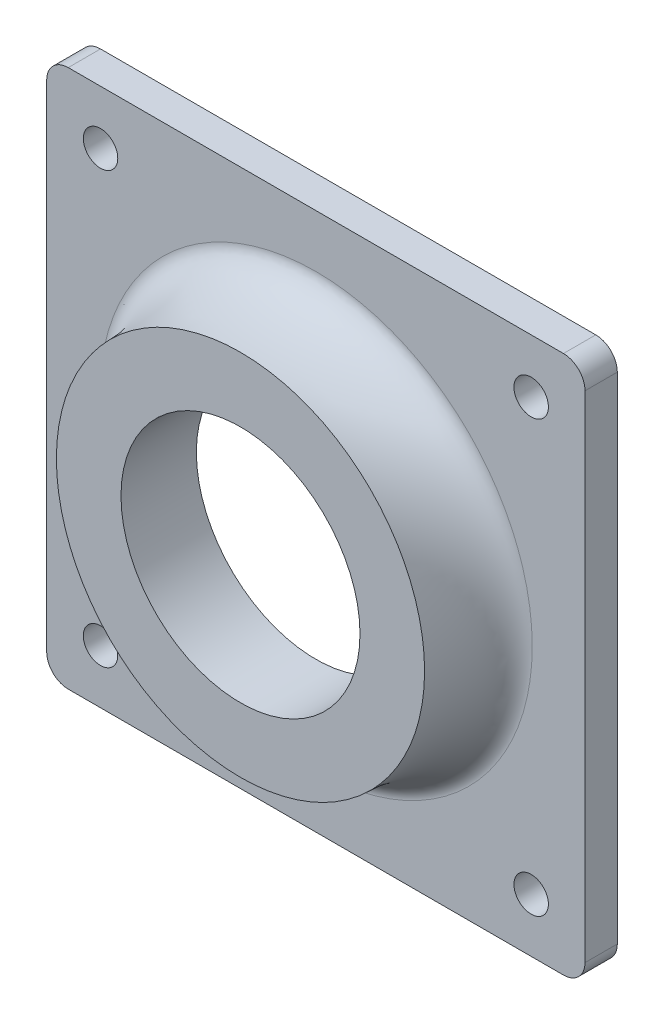
ISO-10303-21;
HEADER;
FILE_DESCRIPTION(('STEP AP214'),'2;1');
FILE_NAME('part.step','',(''),(''),'','','');
FILE_SCHEMA(('AUTOMOTIVE_DESIGN { 1 0 10303 214 1 1 1 1 }'));
ENDSEC;
DATA;
#1=APPLICATION_CONTEXT('core data for automotive mechanical design processes');
#2=APPLICATION_PROTOCOL_DEFINITION('international standard','automotive_design',2000,#1);
#3=PRODUCT_CONTEXT('',#1,'mechanical');
#4=PRODUCT('Part','Part','',(#3));
#5=PRODUCT_RELATED_PRODUCT_CATEGORY('part','',(#4));
#6=PRODUCT_DEFINITION_FORMATION('','',#4);
#7=PRODUCT_DEFINITION_CONTEXT('part definition',#1,'design');
#8=PRODUCT_DEFINITION('design','',#6,#7);
#9=PRODUCT_DEFINITION_SHAPE('','',#8);
#10=(LENGTH_UNIT() NAMED_UNIT(*) SI_UNIT(.MILLI.,.METRE.));
#11=(NAMED_UNIT(*) PLANE_ANGLE_UNIT() SI_UNIT($,.RADIAN.));
#12=(NAMED_UNIT(*) SI_UNIT($,.STERADIAN.) SOLID_ANGLE_UNIT());
#13=UNCERTAINTY_MEASURE_WITH_UNIT(LENGTH_MEASURE(1.E-05),#10,'distance_accuracy_value','');
#14=(GEOMETRIC_REPRESENTATION_CONTEXT(3) GLOBAL_UNCERTAINTY_ASSIGNED_CONTEXT((#13)) GLOBAL_UNIT_ASSIGNED_CONTEXT((#10,
#11,#12)) REPRESENTATION_CONTEXT('',''));
#15=CARTESIAN_POINT('',(0.,0.,0.));
#16=DIRECTION('',(0.,0.,1.));
#17=DIRECTION('',(1.,0.,0.));
#18=AXIS2_PLACEMENT_3D('',#15,#16,#17);
#19=CARTESIAN_POINT('',(0.,0.,10.));
#20=DIRECTION('',(0.,0.,1.));
#21=DIRECTION('',(1.,0.,0.));
#22=AXIS2_PLACEMENT_3D('',#19,#20,#21);
#23=PLANE('',#22);
#24=CARTESIAN_POINT('',(0.,0.,10.));
#25=DIRECTION('',(0.,0.,-1.));
#26=DIRECTION('',(-1.,0.,0.));
#27=AXIS2_PLACEMENT_3D('',#24,#25,#26);
#28=CIRCLE('',#27,11.1);
#29=CARTESIAN_POINT('',(-11.1,0.,10.));
#30=VERTEX_POINT('',#29);
#31=EDGE_CURVE('E195',#30,#30,#28,.T.);
#32=ORIENTED_EDGE('',*,*,#31,.T.);
#33=EDGE_LOOP('',(#32));
#34=FACE_BOUND('',#33,.T.);
#35=CARTESIAN_POINT('',(17.1,0.,10.));
#36=CARTESIAN_POINT('',(17.1,-2.23838476476483,10.));
#37=CARTESIAN_POINT('',(16.6549327706758,-4.47588882339439,10.));
#38=CARTESIAN_POINT('',(14.9417472412102,-8.61188456349167,10.));
#39=CARTESIAN_POINT('',(13.6743030043539,-10.508748912226,10.));
#40=CARTESIAN_POINT('',(10.508748912226,-13.6743030043539,10.));
#41=CARTESIAN_POINT('',(8.61188456347119,-14.9417472412187,10.));
#42=CARTESIAN_POINT('',(4.47588882341487,-16.6549327706673,10.));
#43=CARTESIAN_POINT('',(2.23838476475933,-17.1,10.));
#44=CARTESIAN_POINT('',(-2.23838476475932,-17.1,10.));
#45=CARTESIAN_POINT('',(-4.47588882339609,-16.6549327706751,10.));
#46=CARTESIAN_POINT('',(-8.61188456349003,-14.9417472412109,10.));
#47=CARTESIAN_POINT('',(-10.5087489122237,-13.6743030043562,10.));
#48=CARTESIAN_POINT('',(-13.6743030043562,-10.5087489122237,10.));
#49=CARTESIAN_POINT('',(-14.9417472412102,-8.6118845634916,10.));
#50=CARTESIAN_POINT('',(-16.6549327706758,-4.47588882339442,10.));
#51=CARTESIAN_POINT('',(-17.1,-2.23838476475936,10.));
#52=CARTESIAN_POINT('',(-17.1,2.23838476475929,10.));
#53=CARTESIAN_POINT('',(-16.6549327706741,4.47588882339867,10.));
#54=CARTESIAN_POINT('',(-14.9417472412119,8.61188456348744,10.));
#55=CARTESIAN_POINT('',(-13.674303004355,10.5087489122249,10.));
#56=CARTESIAN_POINT('',(-10.5087489122248,13.6743030043551,10.));
#57=CARTESIAN_POINT('',(-8.61188456348705,14.9417472412121,10.));
#58=CARTESIAN_POINT('',(-4.47588882339898,16.6549327706739,10.));
#59=CARTESIAN_POINT('',(-2.23838476475936,17.1,10.));
#60=CARTESIAN_POINT('',(2.23838476475929,17.1,10.));
#61=CARTESIAN_POINT('',(4.4758888233974,16.6549327706746,10.));
#62=CARTESIAN_POINT('',(8.61188456348869,14.9417472412114,10.));
#63=CARTESIAN_POINT('',(10.5087489122233,13.6743030043566,10.));
#64=CARTESIAN_POINT('',(13.6743030043567,10.5087489122232,10.));
#65=CARTESIAN_POINT('',(14.9417472412121,8.61188456348704,10.));
#66=CARTESIAN_POINT('',(16.6549327706739,4.47588882339897,10.));
#67=CARTESIAN_POINT('',(17.1,2.23838476476483,10.));
#68=CARTESIAN_POINT('',(17.1,0.,10.));
#69=(BOUNDED_CURVE() B_SPLINE_CURVE(3,(#35,#36,#37,#38,#39,#40,#41,#42,#43,#44,#45,#46,#47,#48,
#49,#50,#51,#52,#53,#54,#55,#56,#57,#58,#59,#60,#61,#62,#63,#64,#65,#66,#67,#68),.UNSPECIFIED.,
.T.,.F.) B_SPLINE_CURVE_WITH_KNOTS((4,2,2,2,2,2,2,2,2,2,2,2,2,2,2,2,4),(-6.28318530717959,
-5.89048622548086,-5.49778714378214,-5.10508806208341,-4.71238898038469,-4.31968989868597,
-3.92699081698724,-3.53429173528852,-3.14159265358979,-2.74889357189107,-2.35619449019234,
-1.96349540849362,-1.5707963267949,-1.17809724509617,-0.785398163397448,-0.392699081698725,0.),
.UNSPECIFIED.) CURVE() GEOMETRIC_REPRESENTATION_ITEM() RATIONAL_B_SPLINE_CURVE((1.,1.,1.,1.,1.,
1.,1.,1.,1.,1.,1.,1.,1.,1.,1.,1.,1.,1.,1.,1.,1.,1.,1.,1.,1.,1.,1.,1.,1.,1.,1.,1.,1.,1.)) REPRESENTATION_ITEM(''));
#70=CARTESIAN_POINT('',(17.1,0.,10.));
#71=VERTEX_POINT('',#70);
#72=EDGE_CURVE('E180',#71,#71,#69,.F.);
#73=ORIENTED_EDGE('',*,*,#72,.T.);
#74=EDGE_LOOP('',(#73));
#75=FACE_BOUND('',#74,.T.);
#76=ADVANCED_FACE('F39',(#34,#75),#23,.T.);
#77=CARTESIAN_POINT('',(0.,0.,10.));
#78=DIRECTION('',(0.,0.,-1.));
#79=DIRECTION('',(-1.,0.,0.));
#80=AXIS2_PLACEMENT_3D('',#77,#78,#79);
#81=CYLINDRICAL_SURFACE('',#80,11.1);
#82=ORIENTED_EDGE('',*,*,#31,.F.);
#83=EDGE_LOOP('',(#82));
#84=FACE_BOUND('',#83,.T.);
#85=CARTESIAN_POINT('',(0.,0.,3.));
#86=DIRECTION('',(0.,0.,-1.));
#87=DIRECTION('',(-1.,0.,0.));
#88=AXIS2_PLACEMENT_3D('',#85,#86,#87);
#89=CIRCLE('',#88,11.1);
#90=CARTESIAN_POINT('',(-11.1,0.,3.));
#91=VERTEX_POINT('',#90);
#92=EDGE_CURVE('E198',#91,#91,#89,.T.);
#93=ORIENTED_EDGE('',*,*,#92,.T.);
#94=EDGE_LOOP('',(#93));
#95=FACE_BOUND('',#94,.T.);
#96=ADVANCED_FACE('F224',(#84,#95),#81,.F.);
#97=CARTESIAN_POINT('',(-25.,25.,10.));
#98=DIRECTION('',(1.,0.,0.));
#99=DIRECTION('',(0.,1.,0.));
#100=AXIS2_PLACEMENT_3D('',#97,#98,#99);
#101=PLANE('',#100);
#102=DIRECTION('',(0.,-1.,0.));
#103=VECTOR('',#102,1.);
#104=CARTESIAN_POINT('',(-25.,25.,3.));
#105=LINE('',#104,#103);
#106=CARTESIAN_POINT('',(-25.,23.,3.));
#107=VERTEX_POINT('',#106);
#108=CARTESIAN_POINT('',(-25.,-23.,3.));
#109=VERTEX_POINT('',#108);
#110=EDGE_CURVE('E108',#107,#109,#105,.T.);
#111=ORIENTED_EDGE('',*,*,#110,.F.);
#112=DIRECTION('',(0.,0.,-1.));
#113=VECTOR('',#112,1.);
#114=CARTESIAN_POINT('',(-25.,23.,10.));
#115=LINE('',#114,#113);
#116=CARTESIAN_POINT('',(-25.,23.,0.));
#117=VERTEX_POINT('',#116);
#118=EDGE_CURVE('E122',#107,#117,#115,.T.);
#119=ORIENTED_EDGE('',*,*,#118,.T.);
#120=DIRECTION('',(0.,-1.,0.));
#121=VECTOR('',#120,1.);
#122=CARTESIAN_POINT('',(-25.,25.,0.));
#123=LINE('',#122,#121);
#124=CARTESIAN_POINT('',(-25.,-23.,0.));
#125=VERTEX_POINT('',#124);
#126=EDGE_CURVE('E167',#117,#125,#123,.T.);
#127=ORIENTED_EDGE('',*,*,#126,.T.);
#128=DIRECTION('',(0.,0.,-1.));
#129=VECTOR('',#128,1.);
#130=CARTESIAN_POINT('',(-25.,-23.,10.));
#131=LINE('',#130,#129);
#132=EDGE_CURVE('E125',#125,#109,#131,.F.);
#133=ORIENTED_EDGE('',*,*,#132,.T.);
#134=EDGE_LOOP('',(#111,#119,#127,#133));
#135=FACE_BOUND('',#134,.T.);
#136=ADVANCED_FACE('F120',(#135),#101,.F.);
#137=CARTESIAN_POINT('',(-25.,-25.,10.));
#138=DIRECTION('',(0.,1.,0.));
#139=DIRECTION('',(0.,0.,1.));
#140=AXIS2_PLACEMENT_3D('',#137,#138,#139);
#141=PLANE('',#140);
#142=DIRECTION('',(1.,0.,0.));
#143=VECTOR('',#142,1.);
#144=CARTESIAN_POINT('',(-25.,-25.,0.));
#145=LINE('',#144,#143);
#146=CARTESIAN_POINT('',(-23.,-25.,0.));
#147=VERTEX_POINT('',#146);
#148=CARTESIAN_POINT('',(23.,-25.,0.));
#149=VERTEX_POINT('',#148);
#150=EDGE_CURVE('E160',#147,#149,#145,.T.);
#151=ORIENTED_EDGE('',*,*,#150,.T.);
#152=DIRECTION('',(0.,0.,-1.));
#153=VECTOR('',#152,1.);
#154=CARTESIAN_POINT('',(23.,-25.,10.));
#155=LINE('',#154,#153);
#156=CARTESIAN_POINT('',(23.,-25.,3.));
#157=VERTEX_POINT('',#156);
#158=EDGE_CURVE('E12',#149,#157,#155,.F.);
#159=ORIENTED_EDGE('',*,*,#158,.T.);
#160=DIRECTION('',(1.,0.,0.));
#161=VECTOR('',#160,1.);
#162=CARTESIAN_POINT('',(-25.,-25.,3.));
#163=LINE('',#162,#161);
#164=CARTESIAN_POINT('',(-23.,-25.,3.));
#165=VERTEX_POINT('',#164);
#166=EDGE_CURVE('E126',#165,#157,#163,.T.);
#167=ORIENTED_EDGE('',*,*,#166,.F.);
#168=DIRECTION('',(0.,0.,-1.));
#169=VECTOR('',#168,1.);
#170=CARTESIAN_POINT('',(-23.,-25.,10.));
#171=LINE('',#170,#169);
#172=EDGE_CURVE('E47',#165,#147,#171,.T.);
#173=ORIENTED_EDGE('',*,*,#172,.T.);
#174=EDGE_LOOP('',(#151,#159,#167,#173));
#175=FACE_BOUND('',#174,.T.);
#176=ADVANCED_FACE('F159',(#175),#141,.F.);
#177=CARTESIAN_POINT('',(25.,25.,10.));
#178=DIRECTION('',(-1.,0.,0.));
#179=DIRECTION('',(0.,-1.,0.));
#180=AXIS2_PLACEMENT_3D('',#177,#178,#179);
#181=PLANE('',#180);
#182=DIRECTION('',(0.,1.,0.));
#183=VECTOR('',#182,1.);
#184=CARTESIAN_POINT('',(25.,25.,0.));
#185=LINE('',#184,#183);
#186=CARTESIAN_POINT('',(25.,-23.,0.));
#187=VERTEX_POINT('',#186);
#188=CARTESIAN_POINT('',(25.,23.,0.));
#189=VERTEX_POINT('',#188);
#190=EDGE_CURVE('E166',#187,#189,#185,.T.);
#191=ORIENTED_EDGE('',*,*,#190,.T.);
#192=DIRECTION('',(0.,0.,-1.));
#193=VECTOR('',#192,1.);
#194=CARTESIAN_POINT('',(25.,23.,10.));
#195=LINE('',#194,#193);
#196=CARTESIAN_POINT('',(25.,23.,3.));
#197=VERTEX_POINT('',#196);
#198=EDGE_CURVE('E54',#189,#197,#195,.F.);
#199=ORIENTED_EDGE('',*,*,#198,.T.);
#200=DIRECTION('',(0.,1.,0.));
#201=VECTOR('',#200,1.);
#202=CARTESIAN_POINT('',(25.,-25.,3.));
#203=LINE('',#202,#201);
#204=CARTESIAN_POINT('',(25.,-23.,3.));
#205=VERTEX_POINT('',#204);
#206=EDGE_CURVE('E178',#205,#197,#203,.T.);
#207=ORIENTED_EDGE('',*,*,#206,.F.);
#208=DIRECTION('',(0.,0.,-1.));
#209=VECTOR('',#208,1.);
#210=CARTESIAN_POINT('',(25.,-23.,10.));
#211=LINE('',#210,#209);
#212=EDGE_CURVE('E115',#205,#187,#211,.T.);
#213=ORIENTED_EDGE('',*,*,#212,.T.);
#214=EDGE_LOOP('',(#191,#199,#207,#213));
#215=FACE_BOUND('',#214,.T.);
#216=ADVANCED_FACE('F294',(#215),#181,.F.);
#217=CARTESIAN_POINT('',(-25.,25.,10.));
#218=DIRECTION('',(0.,-1.,0.));
#219=DIRECTION('',(0.,0.,-1.));
#220=AXIS2_PLACEMENT_3D('',#217,#218,#219);
#221=PLANE('',#220);
#222=DIRECTION('',(-1.,0.,0.));
#223=VECTOR('',#222,1.);
#224=CARTESIAN_POINT('',(-25.,25.,0.));
#225=LINE('',#224,#223);
#226=CARTESIAN_POINT('',(23.,25.,0.));
#227=VERTEX_POINT('',#226);
#228=CARTESIAN_POINT('',(-23.,25.,0.));
#229=VERTEX_POINT('',#228);
#230=EDGE_CURVE('E169',#227,#229,#225,.T.);
#231=ORIENTED_EDGE('',*,*,#230,.T.);
#232=DIRECTION('',(0.,0.,-1.));
#233=VECTOR('',#232,1.);
#234=CARTESIAN_POINT('',(-23.,25.,10.));
#235=LINE('',#234,#233);
#236=CARTESIAN_POINT('',(-23.,25.,3.));
#237=VERTEX_POINT('',#236);
#238=EDGE_CURVE('E145',#229,#237,#235,.F.);
#239=ORIENTED_EDGE('',*,*,#238,.T.);
#240=DIRECTION('',(-1.,0.,0.));
#241=VECTOR('',#240,1.);
#242=CARTESIAN_POINT('',(25.,25.,3.));
#243=LINE('',#242,#241);
#244=CARTESIAN_POINT('',(23.,25.,3.));
#245=VERTEX_POINT('',#244);
#246=EDGE_CURVE('E111',#245,#237,#243,.T.);
#247=ORIENTED_EDGE('',*,*,#246,.F.);
#248=DIRECTION('',(0.,0.,-1.));
#249=VECTOR('',#248,1.);
#250=CARTESIAN_POINT('',(23.,25.,10.));
#251=LINE('',#250,#249);
#252=EDGE_CURVE('E142',#245,#227,#251,.T.);
#253=ORIENTED_EDGE('',*,*,#252,.T.);
#254=EDGE_LOOP('',(#231,#239,#247,#253));
#255=FACE_BOUND('',#254,.T.);
#256=ADVANCED_FACE('F297',(#255),#221,.F.);
#257=CARTESIAN_POINT('',(0.,0.,0.));
#258=DIRECTION('',(0.,0.,1.));
#259=DIRECTION('',(1.,0.,0.));
#260=AXIS2_PLACEMENT_3D('',#257,#258,#259);
#261=PLANE('',#260);
#262=CARTESIAN_POINT('',(20.,20.,0.));
#263=DIRECTION('',(0.,0.,-1.));
#264=DIRECTION('',(-1.,0.,0.));
#265=AXIS2_PLACEMENT_3D('',#262,#263,#264);
#266=CIRCLE('',#265,1.6);
#267=CARTESIAN_POINT('',(18.4,20.,0.));
#268=VERTEX_POINT('',#267);
#269=EDGE_CURVE('E309',#268,#268,#266,.T.);
#270=ORIENTED_EDGE('',*,*,#269,.F.);
#271=EDGE_LOOP('',(#270));
#272=FACE_BOUND('',#271,.T.);
#273=CARTESIAN_POINT('',(-20.,-20.,0.));
#274=DIRECTION('',(0.,0.,-1.));
#275=DIRECTION('',(1.,0.,0.));
#276=AXIS2_PLACEMENT_3D('',#273,#274,#275);
#277=CIRCLE('',#276,1.6);
#278=CARTESIAN_POINT('',(-18.4,-20.,0.));
#279=VERTEX_POINT('',#278);
#280=EDGE_CURVE('E313',#279,#279,#277,.T.);
#281=ORIENTED_EDGE('',*,*,#280,.F.);
#282=EDGE_LOOP('',(#281));
#283=FACE_BOUND('',#282,.T.);
#284=CARTESIAN_POINT('',(20.,-20.,0.));
#285=DIRECTION('',(0.,0.,-1.));
#286=DIRECTION('',(1.,0.,0.));
#287=AXIS2_PLACEMENT_3D('',#284,#285,#286);
#288=CIRCLE('',#287,1.6);
#289=CARTESIAN_POINT('',(21.6,-20.,0.));
#290=VERTEX_POINT('',#289);
#291=EDGE_CURVE('E201',#290,#290,#288,.T.);
#292=ORIENTED_EDGE('',*,*,#291,.F.);
#293=EDGE_LOOP('',(#292));
#294=FACE_BOUND('',#293,.T.);
#295=CARTESIAN_POINT('',(-20.,20.,0.));
#296=DIRECTION('',(0.,0.,-1.));
#297=DIRECTION('',(-1.,0.,0.));
#298=AXIS2_PLACEMENT_3D('',#295,#296,#297);
#299=CIRCLE('',#298,1.6);
#300=CARTESIAN_POINT('',(-21.6,20.,0.));
#301=VERTEX_POINT('',#300);
#302=EDGE_CURVE('E187',#301,#301,#299,.T.);
#303=ORIENTED_EDGE('',*,*,#302,.F.);
#304=EDGE_LOOP('',(#303));
#305=FACE_BOUND('',#304,.T.);
#306=CARTESIAN_POINT('',(0.,0.,0.));
#307=DIRECTION('',(0.,0.,-1.));
#308=DIRECTION('',(-1.,0.,0.));
#309=AXIS2_PLACEMENT_3D('',#306,#307,#308);
#310=CIRCLE('',#309,17.1);
#311=CARTESIAN_POINT('',(-17.1,0.,0.));
#312=VERTEX_POINT('',#311);
#313=EDGE_CURVE('E175',#312,#312,#310,.T.);
#314=ORIENTED_EDGE('',*,*,#313,.F.);
#315=EDGE_LOOP('',(#314));
#316=FACE_BOUND('',#315,.T.);
#317=ORIENTED_EDGE('',*,*,#126,.F.);
#318=CARTESIAN_POINT('',(-23.,23.,0.));
#319=DIRECTION('',(0.,0.,1.));
#320=DIRECTION('',(1.,0.,0.));
#321=AXIS2_PLACEMENT_3D('',#318,#319,#320);
#322=CIRCLE('',#321,2.);
#323=EDGE_CURVE('E129',#117,#229,#322,.F.);
#324=ORIENTED_EDGE('',*,*,#323,.T.);
#325=ORIENTED_EDGE('',*,*,#230,.F.);
#326=CARTESIAN_POINT('',(23.,23.,0.));
#327=DIRECTION('',(0.,0.,1.));
#328=DIRECTION('',(1.,0.,0.));
#329=AXIS2_PLACEMENT_3D('',#326,#327,#328);
#330=CIRCLE('',#329,2.);
#331=EDGE_CURVE('E139',#227,#189,#330,.F.);
#332=ORIENTED_EDGE('',*,*,#331,.T.);
#333=ORIENTED_EDGE('',*,*,#190,.F.);
#334=CARTESIAN_POINT('',(23.,-23.,0.));
#335=DIRECTION('',(0.,0.,1.));
#336=DIRECTION('',(1.,0.,0.));
#337=AXIS2_PLACEMENT_3D('',#334,#335,#336);
#338=CIRCLE('',#337,2.);
#339=EDGE_CURVE('E132',#187,#149,#338,.F.);
#340=ORIENTED_EDGE('',*,*,#339,.T.);
#341=ORIENTED_EDGE('',*,*,#150,.F.);
#342=CARTESIAN_POINT('',(-23.,-23.,0.));
#343=DIRECTION('',(0.,0.,1.));
#344=DIRECTION('',(1.,0.,0.));
#345=AXIS2_PLACEMENT_3D('',#342,#343,#344);
#346=CIRCLE('',#345,2.);
#347=EDGE_CURVE('E130',#147,#125,#346,.F.);
#348=ORIENTED_EDGE('',*,*,#347,.T.);
#349=EDGE_LOOP('',(#317,#324,#325,#332,#333,#340,#341,#348));
#350=FACE_BOUND('',#349,.T.);
#351=ADVANCED_FACE('F164',(#272,#283,#294,#305,#316,#350),#261,.F.);
#352=CARTESIAN_POINT('',(0.,0.,3.));
#353=DIRECTION('',(0.,0.,-1.));
#354=DIRECTION('',(-1.,0.,0.));
#355=AXIS2_PLACEMENT_3D('',#352,#353,#354);
#356=CYLINDRICAL_SURFACE('',#355,17.1);
#357=ORIENTED_EDGE('',*,*,#313,.T.);
#358=EDGE_LOOP('',(#357));
#359=FACE_BOUND('',#358,.T.);
#360=CARTESIAN_POINT('',(0.,0.,3.));
#361=DIRECTION('',(0.,0.,-1.));
#362=DIRECTION('',(-1.,0.,0.));
#363=AXIS2_PLACEMENT_3D('',#360,#361,#362);
#364=CIRCLE('',#363,17.1);
#365=CARTESIAN_POINT('',(-17.1,0.,3.));
#366=VERTEX_POINT('',#365);
#367=EDGE_CURVE('E202',#366,#366,#364,.T.);
#368=ORIENTED_EDGE('',*,*,#367,.F.);
#369=EDGE_LOOP('',(#368));
#370=FACE_BOUND('',#369,.T.);
#371=ADVANCED_FACE('F222',(#359,#370),#356,.F.);
#372=CARTESIAN_POINT('',(0.,0.,3.));
#373=DIRECTION('',(0.,0.,1.));
#374=DIRECTION('',(1.,0.,0.));
#375=AXIS2_PLACEMENT_3D('',#372,#373,#374);
#376=PLANE('',#375);
#377=CARTESIAN_POINT('',(20.1,0.,3.));
#378=CARTESIAN_POINT('',(20.1,2.63108384630253,3.));
#379=CARTESIAN_POINT('',(19.5768508006155,5.26113247662571,3.));
#380=CARTESIAN_POINT('',(17.5631064063382,10.1227415044508,3.));
#381=CARTESIAN_POINT('',(16.0733035314346,12.3523890722623,3.));
#382=CARTESIAN_POINT('',(12.3523890722647,16.0733035314368,3.));
#383=CARTESIAN_POINT('',(10.122741504452,17.5631064063337,3.));
#384=CARTESIAN_POINT('',(5.26113247662461,19.57685080062,3.));
#385=CARTESIAN_POINT('',(2.63108384629601,20.1,3.));
#386=CARTESIAN_POINT('',(-2.63108384629609,20.1,3.));
#387=CARTESIAN_POINT('',(-5.26113247662457,19.5768508006155,3.));
#388=CARTESIAN_POINT('',(-10.122741504452,17.5631064063382,3.));
#389=CARTESIAN_POINT('',(-12.352389072263,16.073303531434,3.));
#390=CARTESIAN_POINT('',(-16.0733035314362,12.3523890722653,3.));
#391=CARTESIAN_POINT('',(-17.5631064063381,10.122741504452,3.));
#392=CARTESIAN_POINT('',(-19.5768508006156,5.26113247662464,3.));
#393=CARTESIAN_POINT('',(-20.1,2.631083846296,3.));
#394=CARTESIAN_POINT('',(-20.1,-2.63108384629609,3.));
#395=CARTESIAN_POINT('',(-19.5768508006248,-5.26113247662458,3.));
#396=CARTESIAN_POINT('',(-17.563106406329,-10.122741504452,3.));
#397=CARTESIAN_POINT('',(-16.0733035314339,-12.3523890722607,3.));
#398=CARTESIAN_POINT('',(-12.3523890722653,-16.0733035314385,3.));
#399=CARTESIAN_POINT('',(-10.122741504452,-17.5631064063335,3.));
#400=CARTESIAN_POINT('',(-5.26113247662464,-19.5768508006202,3.));
#401=CARTESIAN_POINT('',(-2.63108384629604,-20.1,3.));
#402=CARTESIAN_POINT('',(2.63108384629606,-20.1,3.));
#403=CARTESIAN_POINT('',(5.26113247664629,-19.5768508006065,3.));
#404=CARTESIAN_POINT('',(10.1227415044303,-17.5631064063472,3.));
#405=CARTESIAN_POINT('',(12.3523890722653,-16.0733035314339,3.));
#406=CARTESIAN_POINT('',(16.0733035314339,-12.3523890722653,3.));
#407=CARTESIAN_POINT('',(17.563106406337,-10.1227415044558,3.));
#408=CARTESIAN_POINT('',(19.5768508006167,-5.26113247662075,3.));
#409=CARTESIAN_POINT('',(20.1,-2.63108384630252,3.));
#410=CARTESIAN_POINT('',(20.1,0.,3.));
#411=(BOUNDED_CURVE() B_SPLINE_CURVE(3,(#377,#378,#379,#380,#381,#382,#383,#384,#385,#386,#387,
#388,#389,#390,#391,#392,#393,#394,#395,#396,#397,#398,#399,#400,#401,#402,#403,#404,#405,#406,
#407,#408,#409,#410),.UNSPECIFIED.,.T.,.F.) B_SPLINE_CURVE_WITH_KNOTS((4,2,2,2,2,2,2,2,2,2,2,2,
2,2,2,2,4),(-6.28318530717959,-5.89048622548086,-5.49778714378214,-5.10508806208341,
-4.71238898038469,-4.31968989868597,-3.92699081698724,-3.53429173528852,-3.14159265358979,
-2.74889357189107,-2.35619449019234,-1.96349540849362,-1.5707963267949,-1.17809724509617,
-0.785398163397448,-0.392699081698724,0.),
.UNSPECIFIED.) CURVE() GEOMETRIC_REPRESENTATION_ITEM() RATIONAL_B_SPLINE_CURVE((1.,1.,1.,1.,1.,
1.,1.,1.,1.,1.,1.,1.,1.,1.,1.,1.,1.,1.,1.,1.,1.,1.,1.,1.,1.,1.,1.,1.,1.,1.,1.,1.,1.,1.)) REPRESENTATION_ITEM(''));
#412=CARTESIAN_POINT('',(20.1,0.,3.));
#413=VERTEX_POINT('',#412);
#414=EDGE_CURVE('E134',#413,#413,#411,.F.);
#415=ORIENTED_EDGE('',*,*,#414,.T.);
#416=EDGE_LOOP('',(#415));
#417=FACE_BOUND('',#416,.T.);
#418=CARTESIAN_POINT('',(20.,20.,3.));
#419=DIRECTION('',(0.,0.,1.));
#420=DIRECTION('',(1.,0.,0.));
#421=AXIS2_PLACEMENT_3D('',#418,#419,#420);
#422=CIRCLE('',#421,1.6);
#423=CARTESIAN_POINT('',(21.6,20.,3.));
#424=VERTEX_POINT('',#423);
#425=EDGE_CURVE('E171',#424,#424,#422,.T.);
#426=ORIENTED_EDGE('',*,*,#425,.F.);
#427=EDGE_LOOP('',(#426));
#428=FACE_BOUND('',#427,.T.);
#429=CARTESIAN_POINT('',(-20.,-20.,3.));
#430=DIRECTION('',(0.,0.,1.));
#431=DIRECTION('',(1.,0.,0.));
#432=AXIS2_PLACEMENT_3D('',#429,#430,#431);
#433=CIRCLE('',#432,1.6);
#434=CARTESIAN_POINT('',(-18.4,-20.,3.));
#435=VERTEX_POINT('',#434);
#436=EDGE_CURVE('E190',#435,#435,#433,.T.);
#437=ORIENTED_EDGE('',*,*,#436,.F.);
#438=EDGE_LOOP('',(#437));
#439=FACE_BOUND('',#438,.T.);
#440=CARTESIAN_POINT('',(20.,-20.,3.));
#441=DIRECTION('',(0.,0.,1.));
#442=DIRECTION('',(1.,0.,0.));
#443=AXIS2_PLACEMENT_3D('',#440,#441,#442);
#444=CIRCLE('',#443,1.6);
#445=CARTESIAN_POINT('',(21.6,-20.,3.));
#446=VERTEX_POINT('',#445);
#447=EDGE_CURVE('E186',#446,#446,#444,.T.);
#448=ORIENTED_EDGE('',*,*,#447,.F.);
#449=EDGE_LOOP('',(#448));
#450=FACE_BOUND('',#449,.T.);
#451=CARTESIAN_POINT('',(-20.,20.,3.));
#452=DIRECTION('',(0.,0.,1.));
#453=DIRECTION('',(1.,0.,0.));
#454=AXIS2_PLACEMENT_3D('',#451,#452,#453);
#455=CIRCLE('',#454,1.6);
#456=CARTESIAN_POINT('',(-18.4,20.,3.));
#457=VERTEX_POINT('',#456);
#458=EDGE_CURVE('E183',#457,#457,#455,.T.);
#459=ORIENTED_EDGE('',*,*,#458,.F.);
#460=EDGE_LOOP('',(#459));
#461=FACE_BOUND('',#460,.T.);
#462=ORIENTED_EDGE('',*,*,#246,.T.);
#463=CARTESIAN_POINT('',(-23.,23.,3.));
#464=DIRECTION('',(0.,0.,1.));
#465=DIRECTION('',(1.,0.,0.));
#466=AXIS2_PLACEMENT_3D('',#463,#464,#465);
#467=CIRCLE('',#466,2.);
#468=EDGE_CURVE('E105',#237,#107,#467,.T.);
#469=ORIENTED_EDGE('',*,*,#468,.T.);
#470=ORIENTED_EDGE('',*,*,#110,.T.);
#471=CARTESIAN_POINT('',(-23.,-23.,3.));
#472=DIRECTION('',(0.,0.,1.));
#473=DIRECTION('',(1.,0.,0.));
#474=AXIS2_PLACEMENT_3D('',#471,#472,#473);
#475=CIRCLE('',#474,2.);
#476=EDGE_CURVE('E147',#109,#165,#475,.T.);
#477=ORIENTED_EDGE('',*,*,#476,.T.);
#478=ORIENTED_EDGE('',*,*,#166,.T.);
#479=CARTESIAN_POINT('',(23.,-23.,3.));
#480=DIRECTION('',(0.,0.,1.));
#481=DIRECTION('',(1.,0.,0.));
#482=AXIS2_PLACEMENT_3D('',#479,#480,#481);
#483=CIRCLE('',#482,2.);
#484=EDGE_CURVE('E61',#157,#205,#483,.T.);
#485=ORIENTED_EDGE('',*,*,#484,.T.);
#486=ORIENTED_EDGE('',*,*,#206,.T.);
#487=CARTESIAN_POINT('',(23.,23.,3.));
#488=DIRECTION('',(0.,0.,1.));
#489=DIRECTION('',(1.,0.,0.));
#490=AXIS2_PLACEMENT_3D('',#487,#488,#489);
#491=CIRCLE('',#490,2.);
#492=EDGE_CURVE('E116',#197,#245,#491,.T.);
#493=ORIENTED_EDGE('',*,*,#492,.T.);
#494=EDGE_LOOP('',(#462,#469,#470,#477,#478,#485,#486,#493));
#495=FACE_BOUND('',#494,.T.);
#496=ADVANCED_FACE('F107',(#417,#428,#439,#450,#461,#495),#376,.T.);
#497=CARTESIAN_POINT('',(-20.,20.,7.));
#498=DIRECTION('',(0.,0.,-1.));
#499=DIRECTION('',(-1.,0.,0.));
#500=AXIS2_PLACEMENT_3D('',#497,#498,#499);
#501=CYLINDRICAL_SURFACE('',#500,1.6);
#502=ORIENTED_EDGE('',*,*,#458,.T.);
#503=EDGE_LOOP('',(#502));
#504=FACE_BOUND('',#503,.T.);
#505=ORIENTED_EDGE('',*,*,#302,.T.);
#506=EDGE_LOOP('',(#505));
#507=FACE_BOUND('',#506,.T.);
#508=ADVANCED_FACE('F221',(#504,#507),#501,.F.);
#509=CARTESIAN_POINT('',(20.,-20.,7.));
#510=DIRECTION('',(0.,0.,-1.));
#511=DIRECTION('',(-1.,0.,0.));
#512=AXIS2_PLACEMENT_3D('',#509,#510,#511);
#513=CYLINDRICAL_SURFACE('',#512,1.6);
#514=ORIENTED_EDGE('',*,*,#447,.T.);
#515=EDGE_LOOP('',(#514));
#516=FACE_BOUND('',#515,.T.);
#517=ORIENTED_EDGE('',*,*,#291,.T.);
#518=EDGE_LOOP('',(#517));
#519=FACE_BOUND('',#518,.T.);
#520=ADVANCED_FACE('F281',(#516,#519),#513,.F.);
#521=CARTESIAN_POINT('',(-20.,-20.,7.));
#522=DIRECTION('',(0.,0.,-1.));
#523=DIRECTION('',(-1.,0.,0.));
#524=AXIS2_PLACEMENT_3D('',#521,#522,#523);
#525=CYLINDRICAL_SURFACE('',#524,1.6);
#526=ORIENTED_EDGE('',*,*,#436,.T.);
#527=EDGE_LOOP('',(#526));
#528=FACE_BOUND('',#527,.T.);
#529=ORIENTED_EDGE('',*,*,#280,.T.);
#530=EDGE_LOOP('',(#529));
#531=FACE_BOUND('',#530,.T.);
#532=ADVANCED_FACE('F275',(#528,#531),#525,.F.);
#533=CARTESIAN_POINT('',(20.,20.,7.));
#534=DIRECTION('',(0.,0.,-1.));
#535=DIRECTION('',(-1.,0.,0.));
#536=AXIS2_PLACEMENT_3D('',#533,#534,#535);
#537=CYLINDRICAL_SURFACE('',#536,1.6);
#538=ORIENTED_EDGE('',*,*,#425,.T.);
#539=EDGE_LOOP('',(#538));
#540=FACE_BOUND('',#539,.T.);
#541=ORIENTED_EDGE('',*,*,#269,.T.);
#542=EDGE_LOOP('',(#541));
#543=FACE_BOUND('',#542,.T.);
#544=ADVANCED_FACE('F268',(#540,#543),#537,.F.);
#545=CARTESIAN_POINT('',(17.1,0.,10.));
#546=CARTESIAN_POINT('',(17.1,2.23838476476483,10.));
#547=CARTESIAN_POINT('',(16.6549327706739,4.47588882339897,10.));
#548=CARTESIAN_POINT('',(14.9417472412121,8.61188456348704,10.));
#549=CARTESIAN_POINT('',(13.6743030043567,10.5087489122232,10.));
#550=CARTESIAN_POINT('',(10.5087489122233,13.6743030043566,10.));
#551=CARTESIAN_POINT('',(8.61188456348869,14.9417472412114,10.));
#552=CARTESIAN_POINT('',(4.4758888233974,16.6549327706746,10.));
#553=CARTESIAN_POINT('',(2.23838476475929,17.1,10.));
#554=CARTESIAN_POINT('',(-2.23838476475936,17.1,10.));
#555=CARTESIAN_POINT('',(-4.47588882339898,16.6549327706739,10.));
#556=CARTESIAN_POINT('',(-8.61188456348705,14.9417472412121,10.));
#557=CARTESIAN_POINT('',(-10.5087489122248,13.6743030043551,10.));
#558=CARTESIAN_POINT('',(-13.674303004355,10.5087489122249,10.));
#559=CARTESIAN_POINT('',(-14.9417472412119,8.61188456348744,10.));
#560=CARTESIAN_POINT('',(-16.6549327706741,4.47588882339867,10.));
#561=CARTESIAN_POINT('',(-17.1,2.23838476475929,10.));
#562=CARTESIAN_POINT('',(-17.1,-2.23838476475936,10.));
#563=CARTESIAN_POINT('',(-16.6549327706758,-4.47588882339442,10.));
#564=CARTESIAN_POINT('',(-14.9417472412102,-8.6118845634916,10.));
#565=CARTESIAN_POINT('',(-13.6743030043562,-10.5087489122237,10.));
#566=CARTESIAN_POINT('',(-10.5087489122237,-13.6743030043562,10.));
#567=CARTESIAN_POINT('',(-8.61188456349003,-14.9417472412109,10.));
#568=CARTESIAN_POINT('',(-4.47588882339609,-16.6549327706751,10.));
#569=CARTESIAN_POINT('',(-2.23838476475932,-17.1,10.));
#570=CARTESIAN_POINT('',(2.23838476475933,-17.1,10.));
#571=CARTESIAN_POINT('',(4.47588882341487,-16.6549327706673,10.));
#572=CARTESIAN_POINT('',(8.61188456347119,-14.9417472412187,10.));
#573=CARTESIAN_POINT('',(10.508748912226,-13.6743030043539,10.));
#574=CARTESIAN_POINT('',(13.6743030043539,-10.508748912226,10.));
#575=CARTESIAN_POINT('',(14.9417472412102,-8.61188456349167,10.));
#576=CARTESIAN_POINT('',(16.6549327706758,-4.47588882339439,10.));
#577=CARTESIAN_POINT('',(17.1,-2.23838476476483,10.));
#578=CARTESIAN_POINT('',(17.1,0.,10.));
#579=CARTESIAN_POINT('',(17.1,0.,3.));
#580=CARTESIAN_POINT('',(17.1,2.23838476476483,3.));
#581=CARTESIAN_POINT('',(16.654932770671,4.47588882339778,3.));
#582=CARTESIAN_POINT('',(14.941747241215,8.61188456348823,3.));
#583=CARTESIAN_POINT('',(13.6743030043567,10.5087489122232,3.));
#584=CARTESIAN_POINT('',(10.5087489122233,13.6743030043566,3.));
#585=CARTESIAN_POINT('',(8.61188456348827,14.9417472412104,2.99999999999658));
#586=CARTESIAN_POINT('',(4.47588882339782,16.6549327706756,3.00000000000342));
#587=CARTESIAN_POINT('',(2.23838476475929,17.1,3.));
#588=CARTESIAN_POINT('',(-2.23838476475936,17.1,3.));
#589=CARTESIAN_POINT('',(-4.47588882339779,16.654932770671,3.00000000000114));
#590=CARTESIAN_POINT('',(-8.61188456348824,14.941747241215,2.99999999999886));
#591=CARTESIAN_POINT('',(-10.5087489122237,13.674303004354,2.99999999999658));
#592=CARTESIAN_POINT('',(-13.6743030043562,10.508748912226,3.00000000000342));
#593=CARTESIAN_POINT('',(-14.9417472412135,8.61188456348808,3.00000000000114));
#594=CARTESIAN_POINT('',(-16.6549327706725,4.47588882339803,2.99999999999886));
#595=CARTESIAN_POINT('',(-17.1,2.23838476475929,3.));
#596=CARTESIAN_POINT('',(-17.1,-2.23838476475936,3.));
#597=CARTESIAN_POINT('',(-16.6549327706817,-4.47588882339684,3.00000000000114));
#598=CARTESIAN_POINT('',(-14.9417472412044,-8.61188456348917,2.99999999999886));
#599=CARTESIAN_POINT('',(-13.6743030043562,-10.5087489122214,2.99999999999772));
#600=CARTESIAN_POINT('',(-10.5087489122237,-13.6743030043585,3.00000000000228));
#601=CARTESIAN_POINT('',(-8.61188456348923,-14.9417472412089,3.));
#602=CARTESIAN_POINT('',(-4.4758888233969,-16.6549327706771,3.));
#603=CARTESIAN_POINT('',(-2.23838476475932,-17.1,2.99999999999886));
#604=CARTESIAN_POINT('',(2.23838476475933,-17.1,3.00000000000114));
#605=CARTESIAN_POINT('',(4.47588882341512,-16.6549327706679,3.00000000000114));
#606=CARTESIAN_POINT('',(8.61188456347094,-14.941747241218,2.99999999999886));
#607=CARTESIAN_POINT('',(10.508748912226,-13.6743030043539,3.00000000000228));
#608=CARTESIAN_POINT('',(13.6743030043539,-10.508748912226,2.99999999999772));
#609=CARTESIAN_POINT('',(14.9417472412125,-8.61188456349264,3.));
#610=CARTESIAN_POINT('',(16.6549327706735,-4.47588882339342,3.));
#611=CARTESIAN_POINT('',(17.1,-2.23838476476483,3.));
#612=CARTESIAN_POINT('',(17.1,0.,3.));
#613=CARTESIAN_POINT('',(20.1,0.,3.));
#614=CARTESIAN_POINT('',(20.1,2.63108384630253,3.));
#615=CARTESIAN_POINT('',(19.5768508006155,5.26113247662571,3.));
#616=CARTESIAN_POINT('',(17.5631064063382,10.1227415044508,3.));
#617=CARTESIAN_POINT('',(16.0733035314346,12.3523890722623,3.));
#618=CARTESIAN_POINT('',(12.3523890722647,16.0733035314368,3.));
#619=CARTESIAN_POINT('',(10.122741504452,17.5631064063337,3.));
#620=CARTESIAN_POINT('',(5.26113247662461,19.57685080062,3.));
#621=CARTESIAN_POINT('',(2.63108384629601,20.1,3.));
#622=CARTESIAN_POINT('',(-2.63108384629609,20.1,3.));
#623=CARTESIAN_POINT('',(-5.26113247662457,19.5768508006155,3.));
#624=CARTESIAN_POINT('',(-10.122741504452,17.5631064063382,3.));
#625=CARTESIAN_POINT('',(-12.352389072263,16.073303531434,3.));
#626=CARTESIAN_POINT('',(-16.0733035314362,12.3523890722653,3.));
#627=CARTESIAN_POINT('',(-17.5631064063381,10.122741504452,3.));
#628=CARTESIAN_POINT('',(-19.5768508006156,5.26113247662464,3.));
#629=CARTESIAN_POINT('',(-20.1,2.631083846296,3.));
#630=CARTESIAN_POINT('',(-20.1,-2.63108384629609,3.));
#631=CARTESIAN_POINT('',(-19.5768508006248,-5.26113247662458,3.));
#632=CARTESIAN_POINT('',(-17.563106406329,-10.122741504452,3.));
#633=CARTESIAN_POINT('',(-16.0733035314339,-12.3523890722607,3.));
#634=CARTESIAN_POINT('',(-12.3523890722653,-16.0733035314385,3.));
#635=CARTESIAN_POINT('',(-10.122741504452,-17.5631064063335,3.));
#636=CARTESIAN_POINT('',(-5.26113247662464,-19.5768508006202,3.));
#637=CARTESIAN_POINT('',(-2.63108384629604,-20.1,3.));
#638=CARTESIAN_POINT('',(2.63108384629606,-20.1,3.));
#639=CARTESIAN_POINT('',(5.26113247664629,-19.5768508006065,3.));
#640=CARTESIAN_POINT('',(10.1227415044303,-17.5631064063472,3.));
#641=CARTESIAN_POINT('',(12.3523890722653,-16.0733035314339,3.));
#642=CARTESIAN_POINT('',(16.0733035314339,-12.3523890722653,3.));
#643=CARTESIAN_POINT('',(17.563106406337,-10.1227415044558,3.));
#644=CARTESIAN_POINT('',(19.5768508006167,-5.26113247662075,3.));
#645=CARTESIAN_POINT('',(20.1,-2.63108384630252,3.));
#646=CARTESIAN_POINT('',(20.1,0.,3.));
#647=(BOUNDED_SURFACE() B_SPLINE_SURFACE(2,3,((#545,#546,#547,#548,#549,#550,#551,#552,#553,
#554,#555,#556,#557,#558,#559,#560,#561,#562,#563,#564,#565,#566,#567,#568,#569,#570,#571,#572,
#573,#574,#575,#576,#577,#578),(#579,#580,#581,#582,#583,#584,#585,#586,#587,#588,#589,#590,
#591,#592,#593,#594,#595,#596,#597,#598,#599,#600,#601,#602,#603,#604,#605,#606,#607,#608,#609,
#610,#611,#612),(#613,#614,#615,#616,#617,#618,#619,#620,#621,#622,#623,#624,#625,#626,#627,
#628,#629,#630,#631,#632,#633,#634,#635,#636,#637,#638,#639,#640,#641,#642,#643,#644,#645,
#646)),.UNSPECIFIED.,.F.,.T.,.F.) B_SPLINE_SURFACE_WITH_KNOTS((3,3),(4,2,2,2,2,2,2,2,2,2,2,2,2,
2,2,2,4),(0.,1.),(-6.28318530717959,-5.89048622548086,-5.49778714378214,-5.10508806208341,
-4.71238898038469,-4.31968989868597,-3.92699081698724,-3.53429173528852,-3.14159265358979,
-2.74889357189107,-2.35619449019234,-1.96349540849362,-1.5707963267949,-1.17809724509617,
-0.785398163397448,-0.392699081698724,0.),
.UNSPECIFIED.) GEOMETRIC_REPRESENTATION_ITEM() RATIONAL_B_SPLINE_SURFACE(((1.,1.,1.,1.,1.,1.,1.,
1.,1.,1.,1.,1.,1.,1.,1.,1.,1.,1.,1.,1.,1.,1.,1.,1.,1.,1.,1.,1.,1.,1.,1.,1.,1.,1.),
(0.707106781186548,0.707106781186548,0.707106781186548,0.707106781186548,0.707106781186548,
0.707106781186548,0.707106781186548,0.707106781186548,0.707106781186548,0.707106781186548,
0.707106781186548,0.707106781186548,0.707106781186548,0.707106781186548,0.707106781186548,
0.707106781186548,0.707106781186548,0.707106781186548,0.707106781186548,0.707106781186548,
0.707106781186548,0.707106781186548,0.707106781186548,0.707106781186548,0.707106781186548,
0.707106781186548,0.707106781186548,0.707106781186548,0.707106781186548,0.707106781186548,
0.707106781186548,0.707106781186548,0.707106781186548,0.707106781186548),(1.,1.,1.,1.,1.,1.,1.,
1.,1.,1.,1.,1.,1.,1.,1.,1.,1.,1.,1.,1.,1.,1.,1.,1.,1.,1.,1.,1.,1.,1.,1.,1.,1.,1.))) REPRESENTATION_ITEM('') SURFACE());
#648=ORIENTED_EDGE('',*,*,#72,.F.);
#649=EDGE_LOOP('',(#648));
#650=FACE_BOUND('',#649,.T.);
#651=ORIENTED_EDGE('',*,*,#414,.F.);
#652=EDGE_LOOP('',(#651));
#653=FACE_BOUND('',#652,.T.);
#654=ADVANCED_FACE('F232',(#650,#653),#647,.T.);
#655=CARTESIAN_POINT('',(0.,0.,3.));
#656=DIRECTION('',(0.,0.,-1.));
#657=DIRECTION('',(-1.,0.,0.));
#658=AXIS2_PLACEMENT_3D('',#655,#656,#657);
#659=PLANE('',#658);
#660=ORIENTED_EDGE('',*,*,#92,.F.);
#661=EDGE_LOOP('',(#660));
#662=FACE_BOUND('',#661,.T.);
#663=ORIENTED_EDGE('',*,*,#367,.T.);
#664=EDGE_LOOP('',(#663));
#665=FACE_BOUND('',#664,.T.);
#666=ADVANCED_FACE('F267',(#662,#665),#659,.T.);
#667=CARTESIAN_POINT('',(-23.,23.,10.));
#668=DIRECTION('',(0.,0.,-1.));
#669=DIRECTION('',(-1.,0.,0.));
#670=AXIS2_PLACEMENT_3D('',#667,#668,#669);
#671=CYLINDRICAL_SURFACE('',#670,2.);
#672=ORIENTED_EDGE('',*,*,#468,.F.);
#673=ORIENTED_EDGE('',*,*,#238,.F.);
#674=ORIENTED_EDGE('',*,*,#323,.F.);
#675=ORIENTED_EDGE('',*,*,#118,.F.);
#676=EDGE_LOOP('',(#672,#673,#674,#675));
#677=FACE_BOUND('',#676,.T.);
#678=ADVANCED_FACE('F128',(#677),#671,.T.);
#679=CARTESIAN_POINT('',(23.,23.,10.));
#680=DIRECTION('',(0.,0.,-1.));
#681=DIRECTION('',(-1.,0.,0.));
#682=AXIS2_PLACEMENT_3D('',#679,#680,#681);
#683=CYLINDRICAL_SURFACE('',#682,2.);
#684=ORIENTED_EDGE('',*,*,#492,.F.);
#685=ORIENTED_EDGE('',*,*,#198,.F.);
#686=ORIENTED_EDGE('',*,*,#331,.F.);
#687=ORIENTED_EDGE('',*,*,#252,.F.);
#688=EDGE_LOOP('',(#684,#685,#686,#687));
#689=FACE_BOUND('',#688,.T.);
#690=ADVANCED_FACE('F338',(#689),#683,.T.);
#691=CARTESIAN_POINT('',(23.,-23.,10.));
#692=DIRECTION('',(0.,0.,-1.));
#693=DIRECTION('',(-1.,0.,0.));
#694=AXIS2_PLACEMENT_3D('',#691,#692,#693);
#695=CYLINDRICAL_SURFACE('',#694,2.);
#696=ORIENTED_EDGE('',*,*,#484,.F.);
#697=ORIENTED_EDGE('',*,*,#158,.F.);
#698=ORIENTED_EDGE('',*,*,#339,.F.);
#699=ORIENTED_EDGE('',*,*,#212,.F.);
#700=EDGE_LOOP('',(#696,#697,#698,#699));
#701=FACE_BOUND('',#700,.T.);
#702=ADVANCED_FACE('F335',(#701),#695,.T.);
#703=CARTESIAN_POINT('',(-23.,-23.,10.));
#704=DIRECTION('',(0.,0.,-1.));
#705=DIRECTION('',(-1.,0.,0.));
#706=AXIS2_PLACEMENT_3D('',#703,#704,#705);
#707=CYLINDRICAL_SURFACE('',#706,2.);
#708=ORIENTED_EDGE('',*,*,#476,.F.);
#709=ORIENTED_EDGE('',*,*,#132,.F.);
#710=ORIENTED_EDGE('',*,*,#347,.F.);
#711=ORIENTED_EDGE('',*,*,#172,.F.);
#712=EDGE_LOOP('',(#708,#709,#710,#711));
#713=FACE_BOUND('',#712,.T.);
#714=ADVANCED_FACE('F41',(#713),#707,.T.);
#715=CLOSED_SHELL('',(#76,#96,#136,#176,#216,#256,#351,#371,#496,#508,#520,#532,#544,#654,#666,
#678,#690,#702,#714));
#716=MANIFOLD_SOLID_BREP('B2',#715);
#717=ADVANCED_BREP_SHAPE_REPRESENTATION('',(#18,#716),#14);
#718=SHAPE_DEFINITION_REPRESENTATION(#9,#717);
ENDSEC;
END-ISO-10303-21;
